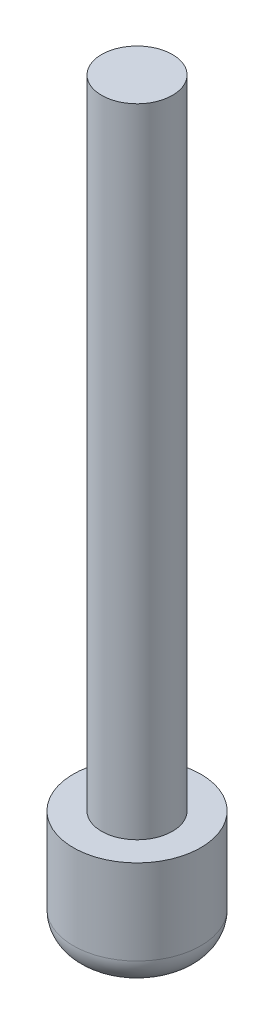
ISO-10303-21;
HEADER;
FILE_DESCRIPTION(('STEP AP214'),'2;1');
FILE_NAME('part.step','',(''),(''),'','','');
FILE_SCHEMA(('AUTOMOTIVE_DESIGN { 1 0 10303 214 1 1 1 1 }'));
ENDSEC;
DATA;
#1=APPLICATION_CONTEXT('core data for automotive mechanical design processes');
#2=APPLICATION_PROTOCOL_DEFINITION('international standard','automotive_design',2000,#1);
#3=PRODUCT_CONTEXT('',#1,'mechanical');
#4=PRODUCT('Part','Part','',(#3));
#5=PRODUCT_RELATED_PRODUCT_CATEGORY('part','',(#4));
#6=PRODUCT_DEFINITION_FORMATION('','',#4);
#7=PRODUCT_DEFINITION_CONTEXT('part definition',#1,'design');
#8=PRODUCT_DEFINITION('design','',#6,#7);
#9=PRODUCT_DEFINITION_SHAPE('','',#8);
#10=(LENGTH_UNIT() NAMED_UNIT(*) SI_UNIT(.MILLI.,.METRE.));
#11=(NAMED_UNIT(*) PLANE_ANGLE_UNIT() SI_UNIT($,.RADIAN.));
#12=(NAMED_UNIT(*) SI_UNIT($,.STERADIAN.) SOLID_ANGLE_UNIT());
#13=UNCERTAINTY_MEASURE_WITH_UNIT(LENGTH_MEASURE(1.E-05),#10,'distance_accuracy_value','');
#14=(GEOMETRIC_REPRESENTATION_CONTEXT(3) GLOBAL_UNCERTAINTY_ASSIGNED_CONTEXT((#13)) GLOBAL_UNIT_ASSIGNED_CONTEXT((#10,
#11,#12)) REPRESENTATION_CONTEXT('',''));
#15=CARTESIAN_POINT('',(0.,0.,0.));
#16=DIRECTION('',(0.,0.,1.));
#17=DIRECTION('',(1.,0.,0.));
#18=AXIS2_PLACEMENT_3D('',#15,#16,#17);
#19=CARTESIAN_POINT('',(0.,22.5,-0.166154527147288));
#20=DIRECTION('',(0.,-1.,0.));
#21=DIRECTION('',(0.,0.,-1.));
#22=AXIS2_PLACEMENT_3D('',#19,#20,#21);
#23=CYLINDRICAL_SURFACE('',#22,1.25);
#24=CARTESIAN_POINT('',(0.,22.5,-0.166154527147288));
#25=DIRECTION('',(0.,1.,0.));
#26=DIRECTION('',(0.,0.,1.));
#27=AXIS2_PLACEMENT_3D('',#24,#25,#26);
#28=CIRCLE('',#27,1.25);
#29=CARTESIAN_POINT('',(0.,22.5,-1.41615452714729));
#30=VERTEX_POINT('',#29);
#31=EDGE_CURVE('E50',#30,#30,#28,.T.);
#32=CARTESIAN_POINT('',(0.,0.,-0.166154527147288));
#33=DIRECTION('',(0.,1.,0.));
#34=DIRECTION('',(0.,0.,1.));
#35=AXIS2_PLACEMENT_3D('',#32,#33,#34);
#36=CIRCLE('',#35,1.25);
#37=CARTESIAN_POINT('',(0.,0.,-1.41615452714729));
#38=VERTEX_POINT('',#37);
#39=EDGE_CURVE('E55',#38,#38,#36,.T.);
#40=CARTESIAN_POINT('',(0.,22.5,-1.41615452714729));
#41=CARTESIAN_POINT('',(0.,22.265625,-1.41615452714729));
#42=CARTESIAN_POINT('',(0.,22.03125,-1.41615452714729));
#43=CARTESIAN_POINT('',(0.,21.5625,-1.41615452714729));
#44=CARTESIAN_POINT('',(0.,21.328125,-1.41615452714729));
#45=CARTESIAN_POINT('',(0.,20.859375,-1.41615452714729));
#46=CARTESIAN_POINT('',(0.,20.625,-1.41615452714729));
#47=CARTESIAN_POINT('',(0.,20.15625,-1.41615452714729));
#48=CARTESIAN_POINT('',(0.,19.921875,-1.41615452714729));
#49=CARTESIAN_POINT('',(0.,19.453125,-1.41615452714729));
#50=CARTESIAN_POINT('',(0.,19.21875,-1.41615452714729));
#51=CARTESIAN_POINT('',(0.,18.75,-1.41615452714729));
#52=CARTESIAN_POINT('',(0.,18.515625,-1.41615452714729));
#53=CARTESIAN_POINT('',(0.,18.046875,-1.41615452714729));
#54=CARTESIAN_POINT('',(0.,17.8125,-1.41615452714729));
#55=CARTESIAN_POINT('',(0.,17.34375,-1.41615452714729));
#56=CARTESIAN_POINT('',(0.,17.109375,-1.41615452714729));
#57=CARTESIAN_POINT('',(0.,16.640625,-1.41615452714729));
#58=CARTESIAN_POINT('',(0.,16.40625,-1.41615452714729));
#59=CARTESIAN_POINT('',(0.,15.9375,-1.41615452714729));
#60=CARTESIAN_POINT('',(0.,15.703125,-1.41615452714729));
#61=CARTESIAN_POINT('',(0.,15.234375,-1.41615452714729));
#62=CARTESIAN_POINT('',(0.,15.,-1.41615452714729));
#63=CARTESIAN_POINT('',(0.,14.53125,-1.41615452714729));
#64=CARTESIAN_POINT('',(0.,14.296875,-1.41615452714729));
#65=CARTESIAN_POINT('',(0.,13.828125,-1.41615452714729));
#66=CARTESIAN_POINT('',(0.,13.59375,-1.41615452714729));
#67=CARTESIAN_POINT('',(0.,13.125,-1.41615452714729));
#68=CARTESIAN_POINT('',(0.,12.890625,-1.41615452714729));
#69=CARTESIAN_POINT('',(0.,12.421875,-1.41615452714729));
#70=CARTESIAN_POINT('',(0.,12.1875,-1.41615452714729));
#71=CARTESIAN_POINT('',(0.,11.71875,-1.41615452714729));
#72=CARTESIAN_POINT('',(0.,11.484375,-1.41615452714729));
#73=CARTESIAN_POINT('',(0.,11.015625,-1.41615452714729));
#74=CARTESIAN_POINT('',(0.,10.78125,-1.41615452714729));
#75=CARTESIAN_POINT('',(0.,10.3125,-1.41615452714729));
#76=CARTESIAN_POINT('',(0.,10.078125,-1.41615452714729));
#77=CARTESIAN_POINT('',(0.,9.609375,-1.41615452714729));
#78=CARTESIAN_POINT('',(0.,9.375,-1.41615452714729));
#79=CARTESIAN_POINT('',(0.,8.90625,-1.41615452714729));
#80=CARTESIAN_POINT('',(0.,8.671875,-1.41615452714729));
#81=CARTESIAN_POINT('',(0.,8.203125,-1.41615452714729));
#82=CARTESIAN_POINT('',(0.,7.96875,-1.41615452714729));
#83=CARTESIAN_POINT('',(0.,7.5,-1.41615452714729));
#84=CARTESIAN_POINT('',(0.,7.265625,-1.41615452714729));
#85=CARTESIAN_POINT('',(0.,6.796875,-1.41615452714729));
#86=CARTESIAN_POINT('',(0.,6.5625,-1.41615452714729));
#87=CARTESIAN_POINT('',(0.,6.09375,-1.41615452714729));
#88=CARTESIAN_POINT('',(0.,5.859375,-1.41615452714729));
#89=CARTESIAN_POINT('',(0.,5.390625,-1.41615452714729));
#90=CARTESIAN_POINT('',(0.,5.15625,-1.41615452714729));
#91=CARTESIAN_POINT('',(0.,4.6875,-1.41615452714729));
#92=CARTESIAN_POINT('',(0.,4.453125,-1.41615452714729));
#93=CARTESIAN_POINT('',(0.,3.984375,-1.41615452714729));
#94=CARTESIAN_POINT('',(0.,3.75,-1.41615452714729));
#95=CARTESIAN_POINT('',(0.,3.28125,-1.41615452714729));
#96=CARTESIAN_POINT('',(0.,3.046875,-1.41615452714729));
#97=CARTESIAN_POINT('',(0.,2.578125,-1.41615452714729));
#98=CARTESIAN_POINT('',(0.,2.34375,-1.41615452714729));
#99=CARTESIAN_POINT('',(0.,1.875,-1.41615452714729));
#100=CARTESIAN_POINT('',(0.,1.640625,-1.41615452714729));
#101=CARTESIAN_POINT('',(0.,1.171875,-1.41615452714729));
#102=CARTESIAN_POINT('',(0.,0.937499999999996,-1.41615452714729));
#103=CARTESIAN_POINT('',(0.,0.468749999999996,-1.41615452714729));
#104=CARTESIAN_POINT('',(0.,0.234374999999996,-1.41615452714729));
#105=CARTESIAN_POINT('',(0.,0.,-1.41615452714729));
#106=B_SPLINE_CURVE_WITH_KNOTS('',3,(#40,#41,#42,#43,#44,#45,#46,#47,#48,#49,#50,#51,#52,#53,
#54,#55,#56,#57,#58,#59,#60,#61,#62,#63,#64,#65,#66,#67,#68,#69,#70,#71,#72,#73,#74,#75,#76,#77,
#78,#79,#80,#81,#82,#83,#84,#85,#86,#87,#88,#89,#90,#91,#92,#93,#94,#95,#96,#97,#98,#99,#100,
#101,#102,#103,#104,#105),.UNSPECIFIED.,.F.,.F.,(4,2,2,2,2,2,2,2,2,2,2,2,2,2,2,2,2,2,2,2,2,2,2,
2,2,2,2,2,2,2,2,2,4),(0.,0.703124999999999,1.40625,2.109375,2.8125,3.515625,4.21875,4.921875,
5.625,6.328125,7.03125,7.734375,8.4375,9.140625,9.84375,10.546875,11.25,11.953125,12.65625,
13.359375,14.0625,14.765625,15.46875,16.171875,16.875,17.578125,18.28125,18.984375,19.6875,
20.390625,21.09375,21.796875,22.5),.UNSPECIFIED.);
#107=EDGE_CURVE('BSEAM37',#30,#38,#106,.T.);
#108=ORIENTED_EDGE('',*,*,#31,.F.);
#109=ORIENTED_EDGE('',*,*,#39,.T.);
#110=ORIENTED_EDGE('',*,*,#107,.T.);
#111=ORIENTED_EDGE('',*,*,#107,.F.);
#112=EDGE_LOOP('',(#108,#110,#109,#111));
#113=FACE_BOUND('',#112,.T.);
#114=ADVANCED_FACE('F37',(#113),#23,.T.);
#115=CARTESIAN_POINT('',(0.,22.5,-0.166154527147288));
#116=DIRECTION('',(0.,1.,0.));
#117=DIRECTION('',(0.,0.,1.));
#118=AXIS2_PLACEMENT_3D('',#115,#116,#117);
#119=PLANE('',#118);
#120=ORIENTED_EDGE('',*,*,#31,.T.);
#121=EDGE_LOOP('',(#120));
#122=FACE_BOUND('',#121,.T.);
#123=ADVANCED_FACE('F82',(#122),#119,.T.);
#124=CARTESIAN_POINT('',(0.,-4.,-0.166154527147288));
#125=DIRECTION('',(0.,1.,0.));
#126=DIRECTION('',(0.,0.,1.));
#127=AXIS2_PLACEMENT_3D('',#124,#125,#126);
#128=CYLINDRICAL_SURFACE('',#127,2.25);
#129=CARTESIAN_POINT('',(0.,-3.,-0.166154527147288));
#130=DIRECTION('',(0.,-1.,0.));
#131=DIRECTION('',(0.,0.,-1.));
#132=AXIS2_PLACEMENT_3D('',#129,#130,#131);
#133=CIRCLE('',#132,2.25);
#134=CARTESIAN_POINT('',(0.,-3.,-2.41615452714729));
#135=VERTEX_POINT('',#134);
#136=EDGE_CURVE('E10',#135,#135,#133,.F.);
#137=ORIENTED_EDGE('',*,*,#136,.T.);
#138=EDGE_LOOP('',(#137));
#139=FACE_BOUND('',#138,.T.);
#140=CARTESIAN_POINT('',(0.,0.,-0.166154527147288));
#141=DIRECTION('',(0.,-1.,0.));
#142=DIRECTION('',(0.,0.,-1.));
#143=AXIS2_PLACEMENT_3D('',#140,#141,#142);
#144=CIRCLE('',#143,2.25);
#145=CARTESIAN_POINT('',(0.,0.,-2.41615452714729));
#146=VERTEX_POINT('',#145);
#147=EDGE_CURVE('E60',#146,#146,#144,.T.);
#148=ORIENTED_EDGE('',*,*,#147,.T.);
#149=EDGE_LOOP('',(#148));
#150=FACE_BOUND('',#149,.T.);
#151=ADVANCED_FACE('F66',(#139,#150),#128,.T.);
#152=CARTESIAN_POINT('',(0.,-4.,-0.166154527147288));
#153=DIRECTION('',(0.,-1.,0.));
#154=DIRECTION('',(0.,0.,-1.));
#155=AXIS2_PLACEMENT_3D('',#152,#153,#154);
#156=PLANE('',#155);
#157=CARTESIAN_POINT('',(0.,-4.,-0.166154527147288));
#158=DIRECTION('',(0.,-1.,0.));
#159=DIRECTION('',(0.,0.,-1.));
#160=AXIS2_PLACEMENT_3D('',#157,#158,#159);
#161=CIRCLE('',#160,1.25);
#162=CARTESIAN_POINT('',(0.,-4.,-1.41615452714729));
#163=VERTEX_POINT('',#162);
#164=EDGE_CURVE('E45',#163,#163,#161,.T.);
#165=ORIENTED_EDGE('',*,*,#164,.T.);
#166=EDGE_LOOP('',(#165));
#167=FACE_BOUND('',#166,.T.);
#168=ADVANCED_FACE('F70',(#167),#156,.T.);
#169=CARTESIAN_POINT('',(0.,0.,-0.166154527147288));
#170=DIRECTION('',(0.,-1.,0.));
#171=DIRECTION('',(0.,0.,-1.));
#172=AXIS2_PLACEMENT_3D('',#169,#170,#171);
#173=PLANE('',#172);
#174=ORIENTED_EDGE('',*,*,#39,.F.);
#175=EDGE_LOOP('',(#174));
#176=FACE_BOUND('',#175,.T.);
#177=ORIENTED_EDGE('',*,*,#147,.F.);
#178=EDGE_LOOP('',(#177));
#179=FACE_BOUND('',#178,.T.);
#180=ADVANCED_FACE('F68',(#176,#179),#173,.F.);
#181=CARTESIAN_POINT('',(0.,-3.,-0.166154527147288));
#182=DIRECTION('',(0.,-1.,0.));
#183=DIRECTION('',(0.,0.,-1.));
#184=AXIS2_PLACEMENT_3D('',#181,#182,#183);
#185=TOROIDAL_SURFACE('',#184,1.25,1.);
#186=ORIENTED_EDGE('',*,*,#136,.F.);
#187=EDGE_LOOP('',(#186));
#188=FACE_BOUND('',#187,.T.);
#189=ORIENTED_EDGE('',*,*,#164,.F.);
#190=EDGE_LOOP('',(#189));
#191=FACE_BOUND('',#190,.T.);
#192=ADVANCED_FACE('F39',(#188,#191),#185,.T.);
#193=CLOSED_SHELL('',(#114,#123,#151,#168,#180,#192));
#194=MANIFOLD_SOLID_BREP('B2',#193);
#195=ADVANCED_BREP_SHAPE_REPRESENTATION('',(#18,#194),#14);
#196=SHAPE_DEFINITION_REPRESENTATION(#9,#195);
ENDSEC;
END-ISO-10303-21;
